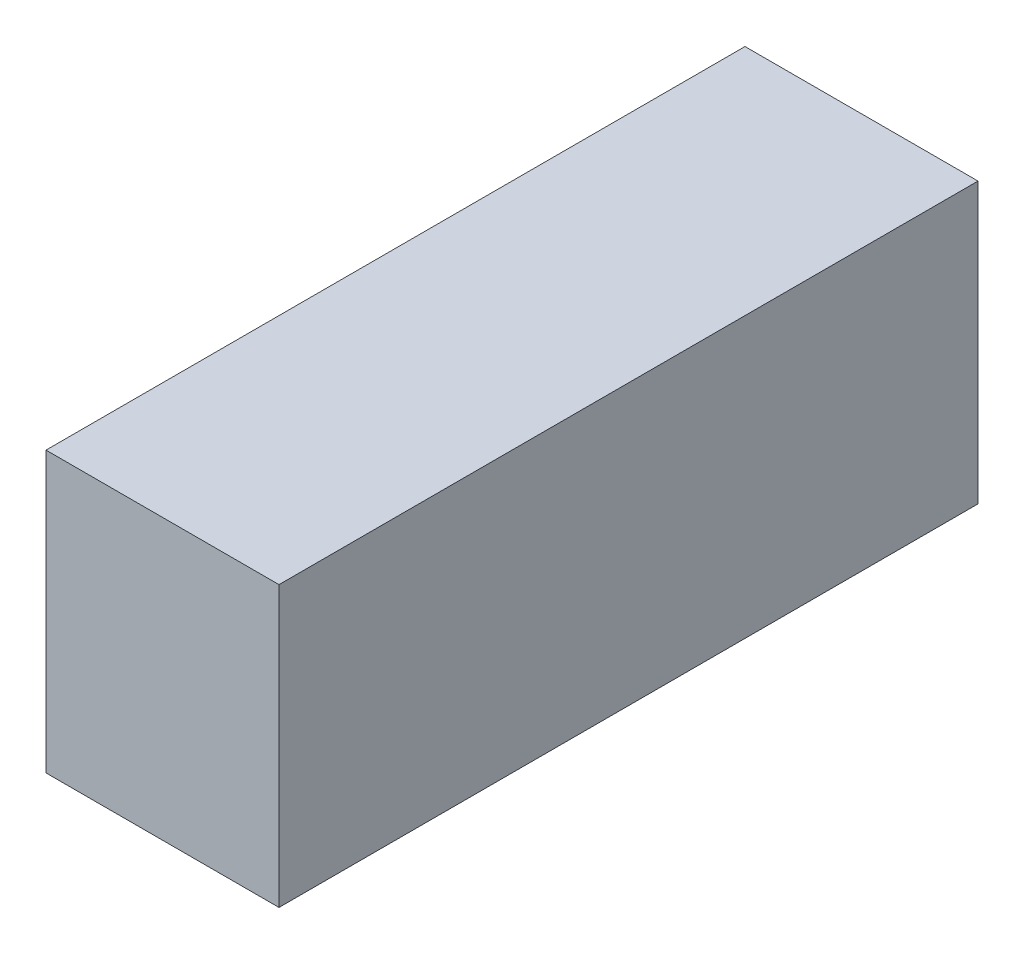
ISO-10303-21;
HEADER;
FILE_DESCRIPTION(('STEP AP214'),'2;1');
FILE_NAME('part.step','',(''),(''),'','','');
FILE_SCHEMA(('AUTOMOTIVE_DESIGN { 1 0 10303 214 1 1 1 1 }'));
ENDSEC;
DATA;
#1=APPLICATION_CONTEXT('core data for automotive mechanical design processes');
#2=APPLICATION_PROTOCOL_DEFINITION('international standard','automotive_design',2000,#1);
#3=PRODUCT_CONTEXT('',#1,'mechanical');
#4=PRODUCT('Part','Part','',(#3));
#5=PRODUCT_RELATED_PRODUCT_CATEGORY('part','',(#4));
#6=PRODUCT_DEFINITION_FORMATION('','',#4);
#7=PRODUCT_DEFINITION_CONTEXT('part definition',#1,'design');
#8=PRODUCT_DEFINITION('design','',#6,#7);
#9=PRODUCT_DEFINITION_SHAPE('','',#8);
#10=(LENGTH_UNIT() NAMED_UNIT(*) SI_UNIT(.MILLI.,.METRE.));
#11=(NAMED_UNIT(*) PLANE_ANGLE_UNIT() SI_UNIT($,.RADIAN.));
#12=(NAMED_UNIT(*) SI_UNIT($,.STERADIAN.) SOLID_ANGLE_UNIT());
#13=UNCERTAINTY_MEASURE_WITH_UNIT(LENGTH_MEASURE(1.E-05),#10,'distance_accuracy_value','');
#14=(GEOMETRIC_REPRESENTATION_CONTEXT(3) GLOBAL_UNCERTAINTY_ASSIGNED_CONTEXT((#13)) GLOBAL_UNIT_ASSIGNED_CONTEXT((#10,
#11,#12)) REPRESENTATION_CONTEXT('',''));
#15=CARTESIAN_POINT('',(0.,0.,0.));
#16=DIRECTION('',(0.,0.,1.));
#17=DIRECTION('',(1.,0.,0.));
#18=AXIS2_PLACEMENT_3D('',#15,#16,#17);
#19=CARTESIAN_POINT('',(0.250000000000002,0.3,1.5));
#20=DIRECTION('',(-1.,0.,0.));
#21=DIRECTION('',(0.,0.,1.));
#22=AXIS2_PLACEMENT_3D('',#19,#20,#21);
#23=PLANE('',#22);
#24=DIRECTION('',(0.,1.,0.));
#25=VECTOR('',#24,1.);
#26=CARTESIAN_POINT('',(0.250000000000002,0.3,0.));
#27=LINE('',#26,#25);
#28=CARTESIAN_POINT('',(0.250000000000002,-0.3,0.));
#29=VERTEX_POINT('',#28);
#30=CARTESIAN_POINT('',(0.250000000000002,0.3,0.));
#31=VERTEX_POINT('',#30);
#32=EDGE_CURVE('E107',#29,#31,#27,.T.);
#33=ORIENTED_EDGE('',*,*,#32,.T.);
#34=DIRECTION('',(0.,0.,-1.));
#35=VECTOR('',#34,1.);
#36=CARTESIAN_POINT('',(0.250000000000002,0.3,1.5));
#37=LINE('',#36,#35);
#38=CARTESIAN_POINT('',(0.250000000000002,0.3,1.5));
#39=VERTEX_POINT('',#38);
#40=EDGE_CURVE('E11',#39,#31,#37,.T.);
#41=ORIENTED_EDGE('',*,*,#40,.F.);
#42=DIRECTION('',(0.,1.,0.));
#43=VECTOR('',#42,1.);
#44=CARTESIAN_POINT('',(0.250000000000002,0.3,1.5));
#45=LINE('',#44,#43);
#46=CARTESIAN_POINT('',(0.250000000000002,-0.3,1.5));
#47=VERTEX_POINT('',#46);
#48=EDGE_CURVE('E91',#47,#39,#45,.T.);
#49=ORIENTED_EDGE('',*,*,#48,.F.);
#50=DIRECTION('',(0.,0.,-1.));
#51=VECTOR('',#50,1.);
#52=CARTESIAN_POINT('',(0.250000000000002,-0.3,1.5));
#53=LINE('',#52,#51);
#54=EDGE_CURVE('E103',#47,#29,#53,.T.);
#55=ORIENTED_EDGE('',*,*,#54,.T.);
#56=EDGE_LOOP('',(#33,#41,#49,#55));
#57=FACE_BOUND('',#56,.T.);
#58=ADVANCED_FACE('F39',(#57),#23,.F.);
#59=CARTESIAN_POINT('',(-0.25,0.3,1.5));
#60=DIRECTION('',(0.,-1.,0.));
#61=DIRECTION('',(0.,0.,-1.));
#62=AXIS2_PLACEMENT_3D('',#59,#60,#61);
#63=PLANE('',#62);
#64=DIRECTION('',(-1.,0.,0.));
#65=VECTOR('',#64,1.);
#66=CARTESIAN_POINT('',(-0.25,0.3,0.));
#67=LINE('',#66,#65);
#68=CARTESIAN_POINT('',(-0.25,0.3,0.));
#69=VERTEX_POINT('',#68);
#70=EDGE_CURVE('E96',#31,#69,#67,.T.);
#71=ORIENTED_EDGE('',*,*,#70,.T.);
#72=DIRECTION('',(0.,0.,-1.));
#73=VECTOR('',#72,1.);
#74=CARTESIAN_POINT('',(-0.25,0.3,1.5));
#75=LINE('',#74,#73);
#76=CARTESIAN_POINT('',(-0.25,0.3,1.5));
#77=VERTEX_POINT('',#76);
#78=EDGE_CURVE('E48',#77,#69,#75,.T.);
#79=ORIENTED_EDGE('',*,*,#78,.F.);
#80=DIRECTION('',(-1.,0.,0.));
#81=VECTOR('',#80,1.);
#82=CARTESIAN_POINT('',(-0.25,0.3,1.5));
#83=LINE('',#82,#81);
#84=EDGE_CURVE('E86',#39,#77,#83,.T.);
#85=ORIENTED_EDGE('',*,*,#84,.F.);
#86=ORIENTED_EDGE('',*,*,#40,.T.);
#87=EDGE_LOOP('',(#71,#79,#85,#86));
#88=FACE_BOUND('',#87,.T.);
#89=ADVANCED_FACE('F95',(#88),#63,.F.);
#90=CARTESIAN_POINT('',(-0.25,0.3,1.5));
#91=DIRECTION('',(1.,0.,0.));
#92=DIRECTION('',(0.,0.,-1.));
#93=AXIS2_PLACEMENT_3D('',#90,#91,#92);
#94=PLANE('',#93);
#95=DIRECTION('',(0.,-1.,0.));
#96=VECTOR('',#95,1.);
#97=CARTESIAN_POINT('',(-0.25,0.3,0.));
#98=LINE('',#97,#96);
#99=CARTESIAN_POINT('',(-0.25,-0.3,0.));
#100=VERTEX_POINT('',#99);
#101=EDGE_CURVE('E73',#69,#100,#98,.T.);
#102=ORIENTED_EDGE('',*,*,#101,.T.);
#103=DIRECTION('',(0.,0.,-1.));
#104=VECTOR('',#103,1.);
#105=CARTESIAN_POINT('',(-0.25,-0.3,1.5));
#106=LINE('',#105,#104);
#107=CARTESIAN_POINT('',(-0.25,-0.3,1.5));
#108=VERTEX_POINT('',#107);
#109=EDGE_CURVE('E98',#108,#100,#106,.T.);
#110=ORIENTED_EDGE('',*,*,#109,.F.);
#111=DIRECTION('',(0.,-1.,0.));
#112=VECTOR('',#111,1.);
#113=CARTESIAN_POINT('',(-0.25,0.3,1.5));
#114=LINE('',#113,#112);
#115=EDGE_CURVE('E89',#77,#108,#114,.T.);
#116=ORIENTED_EDGE('',*,*,#115,.F.);
#117=ORIENTED_EDGE('',*,*,#78,.T.);
#118=EDGE_LOOP('',(#102,#110,#116,#117));
#119=FACE_BOUND('',#118,.T.);
#120=ADVANCED_FACE('F99',(#119),#94,.F.);
#121=CARTESIAN_POINT('',(-0.25,-0.3,1.5));
#122=DIRECTION('',(0.,1.,0.));
#123=DIRECTION('',(0.,0.,1.));
#124=AXIS2_PLACEMENT_3D('',#121,#122,#123);
#125=PLANE('',#124);
#126=DIRECTION('',(1.,0.,0.));
#127=VECTOR('',#126,1.);
#128=CARTESIAN_POINT('',(-0.25,-0.3,0.));
#129=LINE('',#128,#127);
#130=EDGE_CURVE('E79',#100,#29,#129,.T.);
#131=ORIENTED_EDGE('',*,*,#130,.T.);
#132=ORIENTED_EDGE('',*,*,#54,.F.);
#133=DIRECTION('',(1.,0.,0.));
#134=VECTOR('',#133,1.);
#135=CARTESIAN_POINT('',(-0.25,-0.3,1.5));
#136=LINE('',#135,#134);
#137=EDGE_CURVE('E56',#108,#47,#136,.T.);
#138=ORIENTED_EDGE('',*,*,#137,.F.);
#139=ORIENTED_EDGE('',*,*,#109,.T.);
#140=EDGE_LOOP('',(#131,#132,#138,#139));
#141=FACE_BOUND('',#140,.T.);
#142=ADVANCED_FACE('F120',(#141),#125,.F.);
#143=CARTESIAN_POINT('',(0.,0.,1.5));
#144=DIRECTION('',(0.,0.,1.));
#145=DIRECTION('',(1.,0.,0.));
#146=AXIS2_PLACEMENT_3D('',#143,#144,#145);
#147=PLANE('',#146);
#148=ORIENTED_EDGE('',*,*,#48,.T.);
#149=ORIENTED_EDGE('',*,*,#84,.T.);
#150=ORIENTED_EDGE('',*,*,#115,.T.);
#151=ORIENTED_EDGE('',*,*,#137,.T.);
#152=EDGE_LOOP('',(#148,#149,#150,#151));
#153=FACE_BOUND('',#152,.T.);
#154=ADVANCED_FACE('F87',(#153),#147,.T.);
#155=CARTESIAN_POINT('',(0.,0.,0.));
#156=DIRECTION('',(0.,0.,1.));
#157=DIRECTION('',(1.,0.,0.));
#158=AXIS2_PLACEMENT_3D('',#155,#156,#157);
#159=PLANE('',#158);
#160=ORIENTED_EDGE('',*,*,#32,.F.);
#161=ORIENTED_EDGE('',*,*,#130,.F.);
#162=ORIENTED_EDGE('',*,*,#101,.F.);
#163=ORIENTED_EDGE('',*,*,#70,.F.);
#164=EDGE_LOOP('',(#160,#161,#162,#163));
#165=FACE_BOUND('',#164,.T.);
#166=ADVANCED_FACE('F123',(#165),#159,.F.);
#167=CLOSED_SHELL('',(#58,#89,#120,#142,#154,#166));
#168=MANIFOLD_SOLID_BREP('B2',#167);
#169=ADVANCED_BREP_SHAPE_REPRESENTATION('',(#18,#168),#14);
#170=SHAPE_DEFINITION_REPRESENTATION(#9,#169);
ENDSEC;
END-ISO-10303-21;
